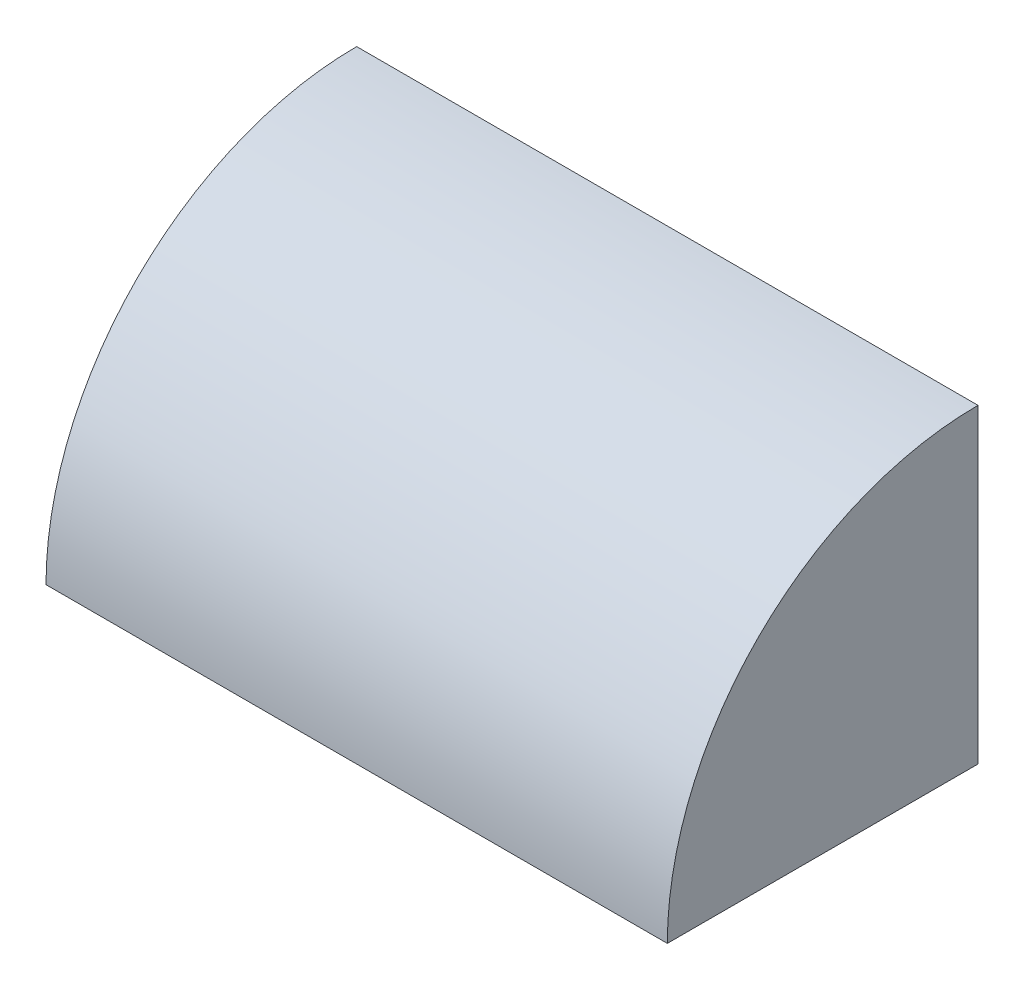
ISO-10303-21;
HEADER;
FILE_DESCRIPTION(('STEP AP214'),'2;1');
FILE_NAME('part.step','',(''),(''),'','','');
FILE_SCHEMA(('AUTOMOTIVE_DESIGN { 1 0 10303 214 1 1 1 1 }'));
ENDSEC;
DATA;
#1=APPLICATION_CONTEXT('core data for automotive mechanical design processes');
#2=APPLICATION_PROTOCOL_DEFINITION('international standard','automotive_design',2000,#1);
#3=PRODUCT_CONTEXT('',#1,'mechanical');
#4=PRODUCT('Part','Part','',(#3));
#5=PRODUCT_RELATED_PRODUCT_CATEGORY('part','',(#4));
#6=PRODUCT_DEFINITION_FORMATION('','',#4);
#7=PRODUCT_DEFINITION_CONTEXT('part definition',#1,'design');
#8=PRODUCT_DEFINITION('design','',#6,#7);
#9=PRODUCT_DEFINITION_SHAPE('','',#8);
#10=(LENGTH_UNIT() NAMED_UNIT(*) SI_UNIT(.MILLI.,.METRE.));
#11=(NAMED_UNIT(*) PLANE_ANGLE_UNIT() SI_UNIT($,.RADIAN.));
#12=(NAMED_UNIT(*) SI_UNIT($,.STERADIAN.) SOLID_ANGLE_UNIT());
#13=UNCERTAINTY_MEASURE_WITH_UNIT(LENGTH_MEASURE(1.E-05),#10,'distance_accuracy_value','');
#14=(GEOMETRIC_REPRESENTATION_CONTEXT(3) GLOBAL_UNCERTAINTY_ASSIGNED_CONTEXT((#13)) GLOBAL_UNIT_ASSIGNED_CONTEXT((#10,
#11,#12)) REPRESENTATION_CONTEXT('',''));
#15=CARTESIAN_POINT('',(0.,0.,0.));
#16=DIRECTION('',(0.,0.,1.));
#17=DIRECTION('',(1.,0.,0.));
#18=AXIS2_PLACEMENT_3D('',#15,#16,#17);
#19=CARTESIAN_POINT('',(0.,149.99,-150.01));
#20=DIRECTION('',(-1.,0.,0.));
#21=DIRECTION('',(0.,0.,1.));
#22=AXIS2_PLACEMENT_3D('',#19,#20,#21);
#23=PLANE('',#22);
#24=DIRECTION('',(0.,1.,0.));
#25=VECTOR('',#24,1.);
#26=CARTESIAN_POINT('',(0.,157.5,-150.));
#27=LINE('',#26,#25);
#28=CARTESIAN_POINT('',(0.,150.,-150.));
#29=VERTEX_POINT('',#28);
#30=CARTESIAN_POINT('',(0.,165.,-150.));
#31=VERTEX_POINT('',#30);
#32=EDGE_CURVE('E51',#29,#31,#27,.T.);
#33=ORIENTED_EDGE('',*,*,#32,.F.);
#34=DIRECTION('',(0.,0.,-1.));
#35=VECTOR('',#34,1.);
#36=CARTESIAN_POINT('',(0.,150.,-142.5));
#37=LINE('',#36,#35);
#38=CARTESIAN_POINT('',(0.,150.,-135.));
#39=VERTEX_POINT('',#38);
#40=EDGE_CURVE('E54',#39,#29,#37,.T.);
#41=ORIENTED_EDGE('',*,*,#40,.F.);
#42=CARTESIAN_POINT('',(0.,150.,-150.));
#43=DIRECTION('',(1.,0.,0.));
#44=DIRECTION('',(0.,0.,-1.));
#45=AXIS2_PLACEMENT_3D('',#42,#43,#44);
#46=CIRCLE('',#45,15.);
#47=EDGE_CURVE('E21',#31,#39,#46,.T.);
#48=ORIENTED_EDGE('',*,*,#47,.F.);
#49=EDGE_LOOP('',(#33,#41,#48));
#50=FACE_BOUND('',#49,.T.);
#51=ADVANCED_FACE('F17',(#50),#23,.T.);
#52=CARTESIAN_POINT('',(-0.01,149.99,-150.));
#53=DIRECTION('',(0.,0.,-1.));
#54=DIRECTION('',(0.,1.,0.));
#55=AXIS2_PLACEMENT_3D('',#52,#53,#54);
#56=PLANE('',#55);
#57=DIRECTION('',(0.,1.,0.));
#58=VECTOR('',#57,1.);
#59=CARTESIAN_POINT('',(30.,157.5,-150.));
#60=LINE('',#59,#58);
#61=CARTESIAN_POINT('',(30.,150.,-150.));
#62=VERTEX_POINT('',#61);
#63=CARTESIAN_POINT('',(30.,165.,-150.));
#64=VERTEX_POINT('',#63);
#65=EDGE_CURVE('E57',#62,#64,#60,.T.);
#66=ORIENTED_EDGE('',*,*,#65,.F.);
#67=DIRECTION('',(1.,0.,0.));
#68=VECTOR('',#67,1.);
#69=CARTESIAN_POINT('',(15.,150.,-150.));
#70=LINE('',#69,#68);
#71=EDGE_CURVE('E63',#29,#62,#70,.T.);
#72=ORIENTED_EDGE('',*,*,#71,.F.);
#73=ORIENTED_EDGE('',*,*,#32,.T.);
#74=DIRECTION('',(-1.,0.,0.));
#75=VECTOR('',#74,1.);
#76=CARTESIAN_POINT('',(15.,165.,-150.));
#77=LINE('',#76,#75);
#78=EDGE_CURVE('E61',#64,#31,#77,.T.);
#79=ORIENTED_EDGE('',*,*,#78,.F.);
#80=EDGE_LOOP('',(#66,#72,#73,#79));
#81=FACE_BOUND('',#80,.T.);
#82=ADVANCED_FACE('F60',(#81),#56,.T.);
#83=CARTESIAN_POINT('',(30.,149.99,-134.99));
#84=DIRECTION('',(1.,0.,0.));
#85=DIRECTION('',(0.,0.,-1.));
#86=AXIS2_PLACEMENT_3D('',#83,#84,#85);
#87=PLANE('',#86);
#88=DIRECTION('',(0.,0.,1.));
#89=VECTOR('',#88,1.);
#90=CARTESIAN_POINT('',(30.,150.,-142.5));
#91=LINE('',#90,#89);
#92=CARTESIAN_POINT('',(30.,150.,-135.));
#93=VERTEX_POINT('',#92);
#94=EDGE_CURVE('E27',#62,#93,#91,.T.);
#95=ORIENTED_EDGE('',*,*,#94,.F.);
#96=ORIENTED_EDGE('',*,*,#65,.T.);
#97=CARTESIAN_POINT('',(30.,150.,-150.));
#98=DIRECTION('',(1.,0.,0.));
#99=DIRECTION('',(0.,0.,-1.));
#100=AXIS2_PLACEMENT_3D('',#97,#98,#99);
#101=CIRCLE('',#100,15.);
#102=EDGE_CURVE('E36',#93,#64,#101,.F.);
#103=ORIENTED_EDGE('',*,*,#102,.F.);
#104=EDGE_LOOP('',(#95,#96,#103));
#105=FACE_BOUND('',#104,.T.);
#106=ADVANCED_FACE('F82',(#105),#87,.T.);
#107=CARTESIAN_POINT('',(0.,150.,-150.));
#108=DIRECTION('',(1.,0.,0.));
#109=DIRECTION('',(0.,0.,-1.));
#110=AXIS2_PLACEMENT_3D('',#107,#108,#109);
#111=CYLINDRICAL_SURFACE('',#110,15.);
#112=ORIENTED_EDGE('',*,*,#102,.T.);
#113=ORIENTED_EDGE('',*,*,#78,.T.);
#114=ORIENTED_EDGE('',*,*,#47,.T.);
#115=DIRECTION('',(-1.,0.,0.));
#116=VECTOR('',#115,1.);
#117=CARTESIAN_POINT('',(15.,150.,-135.));
#118=LINE('',#117,#116);
#119=EDGE_CURVE('E11',#93,#39,#118,.T.);
#120=ORIENTED_EDGE('',*,*,#119,.F.);
#121=EDGE_LOOP('',(#112,#113,#114,#120));
#122=FACE_BOUND('',#121,.T.);
#123=ADVANCED_FACE('F65',(#122),#111,.T.);
#124=CARTESIAN_POINT('',(-0.01,150.,-134.99));
#125=DIRECTION('',(0.,-1.,0.));
#126=DIRECTION('',(0.,0.,-1.));
#127=AXIS2_PLACEMENT_3D('',#124,#125,#126);
#128=PLANE('',#127);
#129=ORIENTED_EDGE('',*,*,#94,.T.);
#130=ORIENTED_EDGE('',*,*,#119,.T.);
#131=ORIENTED_EDGE('',*,*,#40,.T.);
#132=ORIENTED_EDGE('',*,*,#71,.T.);
#133=EDGE_LOOP('',(#129,#130,#131,#132));
#134=FACE_BOUND('',#133,.T.);
#135=ADVANCED_FACE('F19',(#134),#128,.T.);
#136=CLOSED_SHELL('',(#51,#82,#106,#123,#135));
#137=MANIFOLD_SOLID_BREP('B1',#136);
#138=ADVANCED_BREP_SHAPE_REPRESENTATION('',(#18,#137),#14);
#139=SHAPE_DEFINITION_REPRESENTATION(#9,#138);
ENDSEC;
END-ISO-10303-21;
